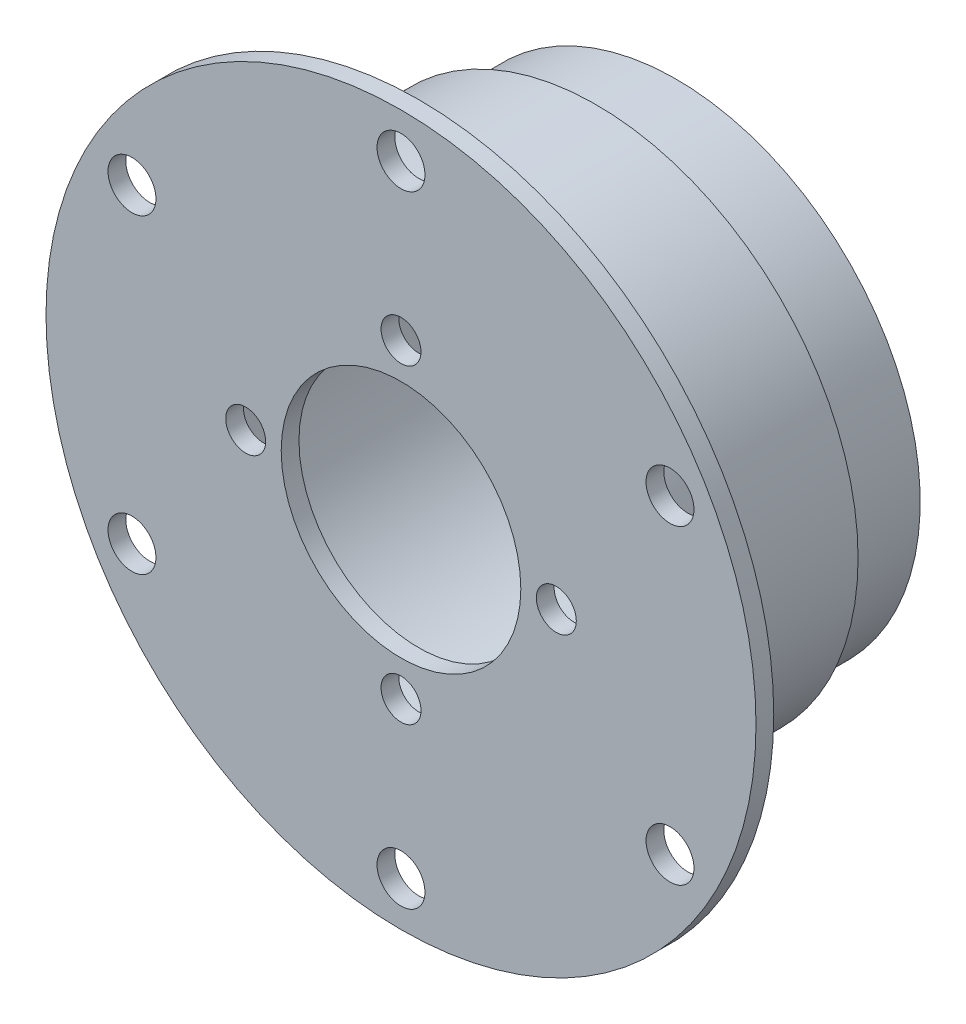
ISO-10303-21;
HEADER;
FILE_DESCRIPTION(('STEP AP214'),'2;1');
FILE_NAME('part.step','',(''),(''),'','','');
FILE_SCHEMA(('AUTOMOTIVE_DESIGN { 1 0 10303 214 1 1 1 1 }'));
ENDSEC;
DATA;
#1=APPLICATION_CONTEXT('core data for automotive mechanical design processes');
#2=APPLICATION_PROTOCOL_DEFINITION('international standard','automotive_design',2000,#1);
#3=PRODUCT_CONTEXT('',#1,'mechanical');
#4=PRODUCT('Part','Part','',(#3));
#5=PRODUCT_RELATED_PRODUCT_CATEGORY('part','',(#4));
#6=PRODUCT_DEFINITION_FORMATION('','',#4);
#7=PRODUCT_DEFINITION_CONTEXT('part definition',#1,'design');
#8=PRODUCT_DEFINITION('design','',#6,#7);
#9=PRODUCT_DEFINITION_SHAPE('','',#8);
#10=(LENGTH_UNIT() NAMED_UNIT(*) SI_UNIT(.MILLI.,.METRE.));
#11=(NAMED_UNIT(*) PLANE_ANGLE_UNIT() SI_UNIT($,.RADIAN.));
#12=(NAMED_UNIT(*) SI_UNIT($,.STERADIAN.) SOLID_ANGLE_UNIT());
#13=UNCERTAINTY_MEASURE_WITH_UNIT(LENGTH_MEASURE(1.E-05),#10,'distance_accuracy_value','');
#14=(GEOMETRIC_REPRESENTATION_CONTEXT(3) GLOBAL_UNCERTAINTY_ASSIGNED_CONTEXT((#13)) GLOBAL_UNIT_ASSIGNED_CONTEXT((#10,
#11,#12)) REPRESENTATION_CONTEXT('',''));
#15=CARTESIAN_POINT('',(0.,0.,0.));
#16=DIRECTION('',(0.,0.,1.));
#17=DIRECTION('',(1.,0.,0.));
#18=AXIS2_PLACEMENT_3D('',#15,#16,#17);
#19=CARTESIAN_POINT('',(0.,0.,-29.));
#20=DIRECTION('',(0.,0.,-1.));
#21=DIRECTION('',(-1.,0.,0.));
#22=AXIS2_PLACEMENT_3D('',#19,#20,#21);
#23=PLANE('',#22);
#24=CARTESIAN_POINT('',(25.,0.,-29.));
#25=DIRECTION('',(0.,0.,-1.));
#26=DIRECTION('',(-1.,0.,0.));
#27=AXIS2_PLACEMENT_3D('',#24,#25,#26);
#28=CIRCLE('',#27,1.24999999999999);
#29=CARTESIAN_POINT('',(23.75,0.,-29.));
#30=VERTEX_POINT('',#29);
#31=EDGE_CURVE('E72',#30,#30,#28,.T.);
#32=ORIENTED_EDGE('',*,*,#31,.F.);
#33=EDGE_LOOP('',(#32));
#34=FACE_BOUND('',#33,.T.);
#35=CARTESIAN_POINT('',(0.,25.,-29.));
#36=DIRECTION('',(0.,0.,-1.));
#37=DIRECTION('',(-1.,0.,0.));
#38=AXIS2_PLACEMENT_3D('',#35,#36,#37);
#39=CIRCLE('',#38,1.24999999999999);
#40=CARTESIAN_POINT('',(-1.25,25.,-29.));
#41=VERTEX_POINT('',#40);
#42=EDGE_CURVE('E71',#41,#41,#39,.T.);
#43=ORIENTED_EDGE('',*,*,#42,.F.);
#44=EDGE_LOOP('',(#43));
#45=FACE_BOUND('',#44,.T.);
#46=CARTESIAN_POINT('',(-25.,0.,-29.));
#47=DIRECTION('',(0.,0.,-1.));
#48=DIRECTION('',(-1.,0.,0.));
#49=AXIS2_PLACEMENT_3D('',#46,#47,#48);
#50=CIRCLE('',#49,1.24999999999999);
#51=CARTESIAN_POINT('',(-26.25,0.,-29.));
#52=VERTEX_POINT('',#51);
#53=EDGE_CURVE('E82',#52,#52,#50,.T.);
#54=ORIENTED_EDGE('',*,*,#53,.F.);
#55=EDGE_LOOP('',(#54));
#56=FACE_BOUND('',#55,.T.);
#57=CARTESIAN_POINT('',(0.,-25.,-29.));
#58=DIRECTION('',(0.,0.,-1.));
#59=DIRECTION('',(-1.,0.,0.));
#60=AXIS2_PLACEMENT_3D('',#57,#58,#59);
#61=CIRCLE('',#60,1.24999999999999);
#62=CARTESIAN_POINT('',(-1.25,-25.,-29.));
#63=VERTEX_POINT('',#62);
#64=EDGE_CURVE('E88',#63,#63,#61,.T.);
#65=ORIENTED_EDGE('',*,*,#64,.F.);
#66=EDGE_LOOP('',(#65));
#67=FACE_BOUND('',#66,.T.);
#68=CARTESIAN_POINT('',(0.,0.,-29.));
#69=DIRECTION('',(0.,0.,-1.));
#70=DIRECTION('',(-1.,0.,0.));
#71=AXIS2_PLACEMENT_3D('',#68,#69,#70);
#72=CIRCLE('',#71,21.5);
#73=CARTESIAN_POINT('',(21.5,0.,-29.));
#74=VERTEX_POINT('',#73);
#75=EDGE_CURVE('E104',#74,#74,#72,.T.);
#76=ORIENTED_EDGE('',*,*,#75,.F.);
#77=EDGE_LOOP('',(#76));
#78=FACE_BOUND('',#77,.T.);
#79=CARTESIAN_POINT('',(0.,0.,-29.));
#80=DIRECTION('',(0.,0.,-1.));
#81=DIRECTION('',(-1.,0.,0.));
#82=AXIS2_PLACEMENT_3D('',#79,#80,#81);
#83=CIRCLE('',#82,27.5);
#84=CARTESIAN_POINT('',(-27.5,0.,-29.));
#85=VERTEX_POINT('',#84);
#86=EDGE_CURVE('E94',#85,#85,#83,.T.);
#87=ORIENTED_EDGE('',*,*,#86,.T.);
#88=EDGE_LOOP('',(#87));
#89=FACE_BOUND('',#88,.T.);
#90=ADVANCED_FACE('F40',(#34,#45,#56,#67,#78,#89),#23,.T.);
#91=CARTESIAN_POINT('',(0.,0.,-29.));
#92=DIRECTION('',(0.,0.,1.));
#93=DIRECTION('',(1.,0.,0.));
#94=AXIS2_PLACEMENT_3D('',#91,#92,#93);
#95=CYLINDRICAL_SURFACE('',#94,29.5);
#96=CARTESIAN_POINT('',(0.,0.,0.));
#97=DIRECTION('',(0.,0.,1.));
#98=DIRECTION('',(1.,0.,0.));
#99=AXIS2_PLACEMENT_3D('',#96,#97,#98);
#100=CIRCLE('',#99,29.5);
#101=CARTESIAN_POINT('',(29.5,0.,0.));
#102=VERTEX_POINT('',#101);
#103=EDGE_CURVE('E11',#102,#102,#100,.F.);
#104=CARTESIAN_POINT('',(0.,0.,-20.));
#105=DIRECTION('',(0.,0.,-1.));
#106=DIRECTION('',(-1.,0.,0.));
#107=AXIS2_PLACEMENT_3D('',#104,#105,#106);
#108=CIRCLE('',#107,29.5);
#109=CARTESIAN_POINT('',(29.5,0.,-20.));
#110=VERTEX_POINT('',#109);
#111=EDGE_CURVE('E98',#110,#110,#108,.T.);
#112=CARTESIAN_POINT('',(29.5,0.,0.));
#113=CARTESIAN_POINT('',(29.5,0.,-0.208333333333334));
#114=CARTESIAN_POINT('',(29.5,0.,-0.416666666666667));
#115=CARTESIAN_POINT('',(29.5,0.,-0.833333333333334));
#116=CARTESIAN_POINT('',(29.5,0.,-1.04166666666667));
#117=CARTESIAN_POINT('',(29.5,0.,-1.45833333333333));
#118=CARTESIAN_POINT('',(29.5,0.,-1.66666666666667));
#119=CARTESIAN_POINT('',(29.5,0.,-2.08333333333334));
#120=CARTESIAN_POINT('',(29.5,0.,-2.29166666666667));
#121=CARTESIAN_POINT('',(29.5,0.,-2.70833333333333));
#122=CARTESIAN_POINT('',(29.5,0.,-2.91666666666667));
#123=CARTESIAN_POINT('',(29.5,0.,-3.33333333333333));
#124=CARTESIAN_POINT('',(29.5,0.,-3.54166666666667));
#125=CARTESIAN_POINT('',(29.5,0.,-3.95833333333333));
#126=CARTESIAN_POINT('',(29.5,0.,-4.16666666666667));
#127=CARTESIAN_POINT('',(29.5,0.,-4.58333333333333));
#128=CARTESIAN_POINT('',(29.5,0.,-4.79166666666667));
#129=CARTESIAN_POINT('',(29.5,0.,-5.20833333333333));
#130=CARTESIAN_POINT('',(29.5,0.,-5.41666666666667));
#131=CARTESIAN_POINT('',(29.5,0.,-5.83333333333334));
#132=CARTESIAN_POINT('',(29.5,0.,-6.04166666666667));
#133=CARTESIAN_POINT('',(29.5,0.,-6.45833333333333));
#134=CARTESIAN_POINT('',(29.5,0.,-6.66666666666667));
#135=CARTESIAN_POINT('',(29.5,0.,-7.08333333333333));
#136=CARTESIAN_POINT('',(29.5,0.,-7.29166666666667));
#137=CARTESIAN_POINT('',(29.5,0.,-7.70833333333333));
#138=CARTESIAN_POINT('',(29.5,0.,-7.91666666666667));
#139=CARTESIAN_POINT('',(29.5,0.,-8.33333333333333));
#140=CARTESIAN_POINT('',(29.5,0.,-8.54166666666667));
#141=CARTESIAN_POINT('',(29.5,0.,-8.95833333333333));
#142=CARTESIAN_POINT('',(29.5,0.,-9.16666666666667));
#143=CARTESIAN_POINT('',(29.5,0.,-9.58333333333333));
#144=CARTESIAN_POINT('',(29.5,0.,-9.79166666666667));
#145=CARTESIAN_POINT('',(29.5,0.,-10.2083333333333));
#146=CARTESIAN_POINT('',(29.5,0.,-10.4166666666667));
#147=CARTESIAN_POINT('',(29.5,0.,-10.8333333333333));
#148=CARTESIAN_POINT('',(29.5,0.,-11.0416666666667));
#149=CARTESIAN_POINT('',(29.5,0.,-11.4583333333333));
#150=CARTESIAN_POINT('',(29.5,0.,-11.6666666666667));
#151=CARTESIAN_POINT('',(29.5,0.,-12.0833333333333));
#152=CARTESIAN_POINT('',(29.5,0.,-12.2916666666667));
#153=CARTESIAN_POINT('',(29.5,0.,-12.7083333333333));
#154=CARTESIAN_POINT('',(29.5,0.,-12.9166666666667));
#155=CARTESIAN_POINT('',(29.5,0.,-13.3333333333333));
#156=CARTESIAN_POINT('',(29.5,0.,-13.5416666666667));
#157=CARTESIAN_POINT('',(29.5,0.,-13.9583333333333));
#158=CARTESIAN_POINT('',(29.5,0.,-14.1666666666667));
#159=CARTESIAN_POINT('',(29.5,0.,-14.5833333333333));
#160=CARTESIAN_POINT('',(29.5,0.,-14.7916666666667));
#161=CARTESIAN_POINT('',(29.5,0.,-15.2083333333333));
#162=CARTESIAN_POINT('',(29.5,0.,-15.4166666666667));
#163=CARTESIAN_POINT('',(29.5,0.,-15.8333333333333));
#164=CARTESIAN_POINT('',(29.5,0.,-16.0416666666667));
#165=CARTESIAN_POINT('',(29.5,0.,-16.4583333333333));
#166=CARTESIAN_POINT('',(29.5,0.,-16.6666666666667));
#167=CARTESIAN_POINT('',(29.5,0.,-17.0833333333333));
#168=CARTESIAN_POINT('',(29.5,0.,-17.2916666666667));
#169=CARTESIAN_POINT('',(29.5,0.,-17.7083333333333));
#170=CARTESIAN_POINT('',(29.5,0.,-17.9166666666667));
#171=CARTESIAN_POINT('',(29.5,0.,-18.3333333333333));
#172=CARTESIAN_POINT('',(29.5,0.,-18.5416666666667));
#173=CARTESIAN_POINT('',(29.5,0.,-18.9583333333333));
#174=CARTESIAN_POINT('',(29.5,0.,-19.1666666666667));
#175=CARTESIAN_POINT('',(29.5,0.,-19.5833333333333));
#176=CARTESIAN_POINT('',(29.5,0.,-19.7916666666667));
#177=CARTESIAN_POINT('',(29.5,0.,-20.));
#178=B_SPLINE_CURVE_WITH_KNOTS('',3,(#112,#113,#114,#115,#116,#117,#118,#119,#120,#121,#122,
#123,#124,#125,#126,#127,#128,#129,#130,#131,#132,#133,#134,#135,#136,#137,#138,#139,#140,#141,
#142,#143,#144,#145,#146,#147,#148,#149,#150,#151,#152,#153,#154,#155,#156,#157,#158,#159,#160,
#161,#162,#163,#164,#165,#166,#167,#168,#169,#170,#171,#172,#173,#174,#175,#176,#177),
.UNSPECIFIED.,.F.,.F.,(4,2,2,2,2,2,2,2,2,2,2,2,2,2,2,2,2,2,2,2,2,2,2,2,2,2,2,2,2,2,2,2,4),(0.,
0.625000000000001,1.25,1.875,2.5,3.125,3.75,4.375,5.,5.625,6.25,6.875,7.5,8.125,8.75,9.375,10.,
10.625,11.25,11.875,12.5,13.125,13.75,14.375,15.,15.625,16.25,16.875,17.5,18.125,18.75,19.375,
20.),.UNSPECIFIED.);
#179=EDGE_CURVE('BSEAM197',#102,#110,#178,.T.);
#180=ORIENTED_EDGE('',*,*,#103,.T.);
#181=ORIENTED_EDGE('',*,*,#111,.F.);
#182=ORIENTED_EDGE('',*,*,#179,.T.);
#183=ORIENTED_EDGE('',*,*,#179,.F.);
#184=EDGE_LOOP('',(#180,#182,#181,#183));
#185=FACE_BOUND('',#184,.T.);
#186=ADVANCED_FACE('F197',(#185),#95,.T.);
#187=CARTESIAN_POINT('',(0.,0.,0.));
#188=DIRECTION('',(0.,0.,1.));
#189=DIRECTION('',(1.,0.,0.));
#190=AXIS2_PLACEMENT_3D('',#187,#188,#189);
#191=PLANE('',#190);
#192=CARTESIAN_POINT('',(0.,0.,0.));
#193=DIRECTION('',(0.,0.,1.));
#194=DIRECTION('',(1.,0.,0.));
#195=AXIS2_PLACEMENT_3D('',#192,#193,#194);
#196=CIRCLE('',#195,13.5);
#197=CARTESIAN_POINT('',(13.5,0.,0.));
#198=VERTEX_POINT('',#197);
#199=EDGE_CURVE('E169',#198,#198,#196,.T.);
#200=ORIENTED_EDGE('',*,*,#199,.T.);
#201=EDGE_LOOP('',(#200));
#202=FACE_BOUND('',#201,.T.);
#203=CARTESIAN_POINT('',(0.,-17.5,0.));
#204=DIRECTION('',(0.,0.,1.));
#205=DIRECTION('',(1.,0.,0.));
#206=AXIS2_PLACEMENT_3D('',#203,#204,#205);
#207=CIRCLE('',#206,2.25);
#208=CARTESIAN_POINT('',(2.25,-17.5,0.));
#209=VERTEX_POINT('',#208);
#210=EDGE_CURVE('E166',#209,#209,#207,.T.);
#211=ORIENTED_EDGE('',*,*,#210,.T.);
#212=EDGE_LOOP('',(#211));
#213=FACE_BOUND('',#212,.T.);
#214=CARTESIAN_POINT('',(17.5,0.,0.));
#215=DIRECTION('',(0.,0.,1.));
#216=DIRECTION('',(1.,0.,0.));
#217=AXIS2_PLACEMENT_3D('',#214,#215,#216);
#218=CIRCLE('',#217,2.25);
#219=CARTESIAN_POINT('',(19.75,0.,0.));
#220=VERTEX_POINT('',#219);
#221=EDGE_CURVE('E160',#220,#220,#218,.T.);
#222=ORIENTED_EDGE('',*,*,#221,.T.);
#223=EDGE_LOOP('',(#222));
#224=FACE_BOUND('',#223,.T.);
#225=CARTESIAN_POINT('',(0.,17.5,0.));
#226=DIRECTION('',(0.,0.,1.));
#227=DIRECTION('',(1.,0.,0.));
#228=AXIS2_PLACEMENT_3D('',#225,#226,#227);
#229=CIRCLE('',#228,2.25);
#230=CARTESIAN_POINT('',(2.25,17.5,0.));
#231=VERTEX_POINT('',#230);
#232=EDGE_CURVE('E154',#231,#231,#229,.T.);
#233=ORIENTED_EDGE('',*,*,#232,.T.);
#234=EDGE_LOOP('',(#233));
#235=FACE_BOUND('',#234,.T.);
#236=CARTESIAN_POINT('',(-17.5,0.,0.));
#237=DIRECTION('',(0.,0.,1.));
#238=DIRECTION('',(1.,0.,0.));
#239=AXIS2_PLACEMENT_3D('',#236,#237,#238);
#240=CIRCLE('',#239,2.25);
#241=CARTESIAN_POINT('',(-15.25,0.,0.));
#242=VERTEX_POINT('',#241);
#243=EDGE_CURVE('E148',#242,#242,#240,.T.);
#244=ORIENTED_EDGE('',*,*,#243,.T.);
#245=EDGE_LOOP('',(#244));
#246=FACE_BOUND('',#245,.T.);
#247=CARTESIAN_POINT('',(0.,0.,0.));
#248=DIRECTION('',(0.,0.,-1.));
#249=DIRECTION('',(-1.,0.,0.));
#250=AXIS2_PLACEMENT_3D('',#247,#248,#249);
#251=CIRCLE('',#250,21.5);
#252=CARTESIAN_POINT('',(21.5,0.,0.));
#253=VERTEX_POINT('',#252);
#254=EDGE_CURVE('E103',#253,#253,#251,.T.);
#255=ORIENTED_EDGE('',*,*,#254,.T.);
#256=EDGE_LOOP('',(#255));
#257=FACE_BOUND('',#256,.T.);
#258=ADVANCED_FACE('F185',(#202,#213,#224,#235,#246,#257),#191,.F.);
#259=CARTESIAN_POINT('',(0.,0.,2.));
#260=DIRECTION('',(0.,0.,1.));
#261=DIRECTION('',(1.,0.,0.));
#262=AXIS2_PLACEMENT_3D('',#259,#260,#261);
#263=PLANE('',#262);
#264=CARTESIAN_POINT('',(0.,35.,2.));
#265=DIRECTION('',(0.,0.,-1.));
#266=DIRECTION('',(-1.,0.,0.));
#267=AXIS2_PLACEMENT_3D('',#264,#265,#266);
#268=CIRCLE('',#267,2.7);
#269=CARTESIAN_POINT('',(-2.7,35.,2.));
#270=VERTEX_POINT('',#269);
#271=EDGE_CURVE('E112',#270,#270,#268,.T.);
#272=ORIENTED_EDGE('',*,*,#271,.T.);
#273=EDGE_LOOP('',(#272));
#274=FACE_BOUND('',#273,.T.);
#275=CARTESIAN_POINT('',(-30.3108891324554,17.4999999999999,2.));
#276=DIRECTION('',(0.,0.,-1.));
#277=DIRECTION('',(-1.,0.,0.));
#278=AXIS2_PLACEMENT_3D('',#275,#276,#277);
#279=CIRCLE('',#278,2.7);
#280=CARTESIAN_POINT('',(-33.0108891324554,17.4999999999999,2.));
#281=VERTEX_POINT('',#280);
#282=EDGE_CURVE('E118',#281,#281,#279,.T.);
#283=ORIENTED_EDGE('',*,*,#282,.T.);
#284=EDGE_LOOP('',(#283));
#285=FACE_BOUND('',#284,.T.);
#286=CARTESIAN_POINT('',(-30.3108891324553,-17.5000000000001,2.));
#287=DIRECTION('',(0.,0.,-1.));
#288=DIRECTION('',(-1.,0.,0.));
#289=AXIS2_PLACEMENT_3D('',#286,#287,#288);
#290=CIRCLE('',#289,2.7);
#291=CARTESIAN_POINT('',(-33.0108891324553,-17.5000000000001,2.));
#292=VERTEX_POINT('',#291);
#293=EDGE_CURVE('E124',#292,#292,#290,.T.);
#294=ORIENTED_EDGE('',*,*,#293,.T.);
#295=EDGE_LOOP('',(#294));
#296=FACE_BOUND('',#295,.T.);
#297=CARTESIAN_POINT('',(2.44403693719019E-13,-35.,2.));
#298=DIRECTION('',(0.,0.,-1.));
#299=DIRECTION('',(-1.,0.,0.));
#300=AXIS2_PLACEMENT_3D('',#297,#298,#299);
#301=CIRCLE('',#300,2.7);
#302=CARTESIAN_POINT('',(-2.69999999999976,-35.,2.));
#303=VERTEX_POINT('',#302);
#304=EDGE_CURVE('E130',#303,#303,#301,.T.);
#305=ORIENTED_EDGE('',*,*,#304,.T.);
#306=EDGE_LOOP('',(#305));
#307=FACE_BOUND('',#306,.T.);
#308=CARTESIAN_POINT('',(30.3108891324555,-17.4999999999997,2.));
#309=DIRECTION('',(0.,0.,-1.));
#310=DIRECTION('',(-1.,0.,0.));
#311=AXIS2_PLACEMENT_3D('',#308,#309,#310);
#312=CIRCLE('',#311,2.7);
#313=CARTESIAN_POINT('',(27.6108891324555,-17.4999999999997,2.));
#314=VERTEX_POINT('',#313);
#315=EDGE_CURVE('E136',#314,#314,#312,.T.);
#316=ORIENTED_EDGE('',*,*,#315,.T.);
#317=EDGE_LOOP('',(#316));
#318=FACE_BOUND('',#317,.T.);
#319=CARTESIAN_POINT('',(30.3108891324552,17.5000000000004,2.));
#320=DIRECTION('',(0.,0.,-1.));
#321=DIRECTION('',(-1.,0.,0.));
#322=AXIS2_PLACEMENT_3D('',#319,#320,#321);
#323=CIRCLE('',#322,2.7);
#324=CARTESIAN_POINT('',(27.6108891324551,17.5000000000004,2.));
#325=VERTEX_POINT('',#324);
#326=EDGE_CURVE('E142',#325,#325,#323,.T.);
#327=ORIENTED_EDGE('',*,*,#326,.T.);
#328=EDGE_LOOP('',(#327));
#329=FACE_BOUND('',#328,.T.);
#330=CARTESIAN_POINT('',(-17.5,0.,2.));
#331=DIRECTION('',(0.,0.,1.));
#332=DIRECTION('',(1.,0.,0.));
#333=AXIS2_PLACEMENT_3D('',#330,#331,#332);
#334=CIRCLE('',#333,2.24999999999999);
#335=CARTESIAN_POINT('',(-15.25,0.,2.));
#336=VERTEX_POINT('',#335);
#337=EDGE_CURVE('E145',#336,#336,#334,.T.);
#338=ORIENTED_EDGE('',*,*,#337,.F.);
#339=EDGE_LOOP('',(#338));
#340=FACE_BOUND('',#339,.T.);
#341=CARTESIAN_POINT('',(0.,17.5,2.));
#342=DIRECTION('',(0.,0.,1.));
#343=DIRECTION('',(1.,0.,0.));
#344=AXIS2_PLACEMENT_3D('',#341,#342,#343);
#345=CIRCLE('',#344,2.24999999999999);
#346=CARTESIAN_POINT('',(2.24999999999999,17.5,2.));
#347=VERTEX_POINT('',#346);
#348=EDGE_CURVE('E151',#347,#347,#345,.T.);
#349=ORIENTED_EDGE('',*,*,#348,.F.);
#350=EDGE_LOOP('',(#349));
#351=FACE_BOUND('',#350,.T.);
#352=CARTESIAN_POINT('',(17.5,0.,2.));
#353=DIRECTION('',(0.,0.,1.));
#354=DIRECTION('',(1.,0.,0.));
#355=AXIS2_PLACEMENT_3D('',#352,#353,#354);
#356=CIRCLE('',#355,2.24999999999999);
#357=CARTESIAN_POINT('',(19.75,0.,2.));
#358=VERTEX_POINT('',#357);
#359=EDGE_CURVE('E157',#358,#358,#356,.T.);
#360=ORIENTED_EDGE('',*,*,#359,.F.);
#361=EDGE_LOOP('',(#360));
#362=FACE_BOUND('',#361,.T.);
#363=CARTESIAN_POINT('',(0.,-17.5,2.));
#364=DIRECTION('',(0.,0.,1.));
#365=DIRECTION('',(1.,0.,0.));
#366=AXIS2_PLACEMENT_3D('',#363,#364,#365);
#367=CIRCLE('',#366,2.24999999999999);
#368=CARTESIAN_POINT('',(2.24999999999999,-17.5,2.));
#369=VERTEX_POINT('',#368);
#370=EDGE_CURVE('E163',#369,#369,#367,.T.);
#371=ORIENTED_EDGE('',*,*,#370,.F.);
#372=EDGE_LOOP('',(#371));
#373=FACE_BOUND('',#372,.T.);
#374=CARTESIAN_POINT('',(0.,0.,2.));
#375=DIRECTION('',(0.,0.,1.));
#376=DIRECTION('',(1.,0.,0.));
#377=AXIS2_PLACEMENT_3D('',#374,#375,#376);
#378=CIRCLE('',#377,40.);
#379=CARTESIAN_POINT('',(40.,0.,2.));
#380=VERTEX_POINT('',#379);
#381=EDGE_CURVE('E48',#380,#380,#378,.T.);
#382=ORIENTED_EDGE('',*,*,#381,.T.);
#383=EDGE_LOOP('',(#382));
#384=FACE_BOUND('',#383,.T.);
#385=CARTESIAN_POINT('',(0.,0.,2.));
#386=DIRECTION('',(0.,0.,1.));
#387=DIRECTION('',(1.,0.,0.));
#388=AXIS2_PLACEMENT_3D('',#385,#386,#387);
#389=CIRCLE('',#388,13.5);
#390=CARTESIAN_POINT('',(13.5,0.,2.));
#391=VERTEX_POINT('',#390);
#392=EDGE_CURVE('E170',#391,#391,#389,.T.);
#393=ORIENTED_EDGE('',*,*,#392,.F.);
#394=EDGE_LOOP('',(#393));
#395=FACE_BOUND('',#394,.T.);
#396=ADVANCED_FACE('F183',(#274,#285,#296,#307,#318,#329,#340,#351,#362,#373,#384,#395),#263,.T.);
#397=ORIENTED_EDGE('',*,*,#103,.F.);
#398=EDGE_LOOP('',(#397));
#399=FACE_BOUND('',#398,.T.);
#400=CARTESIAN_POINT('',(0.,35.,0.));
#401=DIRECTION('',(0.,0.,-1.));
#402=DIRECTION('',(-1.,0.,0.));
#403=AXIS2_PLACEMENT_3D('',#400,#401,#402);
#404=CIRCLE('',#403,2.7);
#405=CARTESIAN_POINT('',(-2.7,35.,0.));
#406=VERTEX_POINT('',#405);
#407=EDGE_CURVE('E107',#406,#406,#404,.T.);
#408=ORIENTED_EDGE('',*,*,#407,.F.);
#409=EDGE_LOOP('',(#408));
#410=FACE_BOUND('',#409,.T.);
#411=CARTESIAN_POINT('',(-30.3108891324554,17.4999999999999,0.));
#412=DIRECTION('',(0.,0.,-1.));
#413=DIRECTION('',(-1.,0.,0.));
#414=AXIS2_PLACEMENT_3D('',#411,#412,#413);
#415=CIRCLE('',#414,2.7);
#416=CARTESIAN_POINT('',(-33.0108891324554,17.4999999999999,0.));
#417=VERTEX_POINT('',#416);
#418=EDGE_CURVE('E115',#417,#417,#415,.T.);
#419=ORIENTED_EDGE('',*,*,#418,.F.);
#420=EDGE_LOOP('',(#419));
#421=FACE_BOUND('',#420,.T.);
#422=CARTESIAN_POINT('',(-30.3108891324553,-17.5000000000001,0.));
#423=DIRECTION('',(0.,0.,-1.));
#424=DIRECTION('',(-1.,0.,0.));
#425=AXIS2_PLACEMENT_3D('',#422,#423,#424);
#426=CIRCLE('',#425,2.7);
#427=CARTESIAN_POINT('',(-33.0108891324553,-17.5000000000001,0.));
#428=VERTEX_POINT('',#427);
#429=EDGE_CURVE('E121',#428,#428,#426,.T.);
#430=ORIENTED_EDGE('',*,*,#429,.F.);
#431=EDGE_LOOP('',(#430));
#432=FACE_BOUND('',#431,.T.);
#433=CARTESIAN_POINT('',(2.44403693719019E-13,-35.,0.));
#434=DIRECTION('',(0.,0.,-1.));
#435=DIRECTION('',(-1.,0.,0.));
#436=AXIS2_PLACEMENT_3D('',#433,#434,#435);
#437=CIRCLE('',#436,2.7);
#438=CARTESIAN_POINT('',(-2.69999999999976,-35.,0.));
#439=VERTEX_POINT('',#438);
#440=EDGE_CURVE('E127',#439,#439,#437,.T.);
#441=ORIENTED_EDGE('',*,*,#440,.F.);
#442=EDGE_LOOP('',(#441));
#443=FACE_BOUND('',#442,.T.);
#444=CARTESIAN_POINT('',(30.3108891324555,-17.4999999999997,0.));
#445=DIRECTION('',(0.,0.,-1.));
#446=DIRECTION('',(-1.,0.,0.));
#447=AXIS2_PLACEMENT_3D('',#444,#445,#446);
#448=CIRCLE('',#447,2.7);
#449=CARTESIAN_POINT('',(27.6108891324555,-17.4999999999997,0.));
#450=VERTEX_POINT('',#449);
#451=EDGE_CURVE('E133',#450,#450,#448,.T.);
#452=ORIENTED_EDGE('',*,*,#451,.F.);
#453=EDGE_LOOP('',(#452));
#454=FACE_BOUND('',#453,.T.);
#455=CARTESIAN_POINT('',(30.3108891324552,17.5000000000004,0.));
#456=DIRECTION('',(0.,0.,-1.));
#457=DIRECTION('',(-1.,0.,0.));
#458=AXIS2_PLACEMENT_3D('',#455,#456,#457);
#459=CIRCLE('',#458,2.7);
#460=CARTESIAN_POINT('',(27.6108891324551,17.5000000000004,0.));
#461=VERTEX_POINT('',#460);
#462=EDGE_CURVE('E139',#461,#461,#459,.T.);
#463=ORIENTED_EDGE('',*,*,#462,.F.);
#464=EDGE_LOOP('',(#463));
#465=FACE_BOUND('',#464,.T.);
#466=CARTESIAN_POINT('',(0.,0.,0.));
#467=DIRECTION('',(0.,0.,1.));
#468=DIRECTION('',(1.,0.,0.));
#469=AXIS2_PLACEMENT_3D('',#466,#467,#468);
#470=CIRCLE('',#469,40.);
#471=CARTESIAN_POINT('',(40.,0.,0.));
#472=VERTEX_POINT('',#471);
#473=EDGE_CURVE('E173',#472,#472,#470,.T.);
#474=ORIENTED_EDGE('',*,*,#473,.F.);
#475=EDGE_LOOP('',(#474));
#476=FACE_BOUND('',#475,.T.);
#477=ADVANCED_FACE('F181',(#399,#410,#421,#432,#443,#454,#465,#476),#191,.F.);
#478=CARTESIAN_POINT('',(0.,0.,2.));
#479=DIRECTION('',(0.,0.,-1.));
#480=DIRECTION('',(-1.,0.,0.));
#481=AXIS2_PLACEMENT_3D('',#478,#479,#480);
#482=CYLINDRICAL_SURFACE('',#481,40.);
#483=ORIENTED_EDGE('',*,*,#381,.F.);
#484=EDGE_LOOP('',(#483));
#485=FACE_BOUND('',#484,.T.);
#486=ORIENTED_EDGE('',*,*,#473,.T.);
#487=EDGE_LOOP('',(#486));
#488=FACE_BOUND('',#487,.T.);
#489=ADVANCED_FACE('F42',(#485,#488),#482,.T.);
#490=CARTESIAN_POINT('',(0.,0.,2.));
#491=DIRECTION('',(0.,0.,-1.));
#492=DIRECTION('',(-1.,0.,0.));
#493=AXIS2_PLACEMENT_3D('',#490,#491,#492);
#494=CYLINDRICAL_SURFACE('',#493,13.5);
#495=ORIENTED_EDGE('',*,*,#392,.T.);
#496=EDGE_LOOP('',(#495));
#497=FACE_BOUND('',#496,.T.);
#498=ORIENTED_EDGE('',*,*,#199,.F.);
#499=EDGE_LOOP('',(#498));
#500=FACE_BOUND('',#499,.T.);
#501=ADVANCED_FACE('F190',(#497,#500),#494,.F.);
#502=CARTESIAN_POINT('',(0.,-17.5,2.));
#503=DIRECTION('',(0.,0.,1.));
#504=DIRECTION('',(1.,0.,0.));
#505=AXIS2_PLACEMENT_3D('',#502,#503,#504);
#506=CYLINDRICAL_SURFACE('',#505,2.24999999999999);
#507=ORIENTED_EDGE('',*,*,#210,.F.);
#508=EDGE_LOOP('',(#507));
#509=FACE_BOUND('',#508,.T.);
#510=ORIENTED_EDGE('',*,*,#370,.T.);
#511=EDGE_LOOP('',(#510));
#512=FACE_BOUND('',#511,.T.);
#513=ADVANCED_FACE('F248',(#509,#512),#506,.F.);
#514=CARTESIAN_POINT('',(17.5,0.,2.));
#515=DIRECTION('',(0.,0.,1.));
#516=DIRECTION('',(1.,0.,0.));
#517=AXIS2_PLACEMENT_3D('',#514,#515,#516);
#518=CYLINDRICAL_SURFACE('',#517,2.24999999999999);
#519=ORIENTED_EDGE('',*,*,#221,.F.);
#520=EDGE_LOOP('',(#519));
#521=FACE_BOUND('',#520,.T.);
#522=ORIENTED_EDGE('',*,*,#359,.T.);
#523=EDGE_LOOP('',(#522));
#524=FACE_BOUND('',#523,.T.);
#525=ADVANCED_FACE('F244',(#521,#524),#518,.F.);
#526=CARTESIAN_POINT('',(0.,17.5,2.));
#527=DIRECTION('',(0.,0.,1.));
#528=DIRECTION('',(1.,0.,0.));
#529=AXIS2_PLACEMENT_3D('',#526,#527,#528);
#530=CYLINDRICAL_SURFACE('',#529,2.24999999999999);
#531=ORIENTED_EDGE('',*,*,#232,.F.);
#532=EDGE_LOOP('',(#531));
#533=FACE_BOUND('',#532,.T.);
#534=ORIENTED_EDGE('',*,*,#348,.T.);
#535=EDGE_LOOP('',(#534));
#536=FACE_BOUND('',#535,.T.);
#537=ADVANCED_FACE('F240',(#533,#536),#530,.F.);
#538=CARTESIAN_POINT('',(-17.5,0.,2.));
#539=DIRECTION('',(0.,0.,1.));
#540=DIRECTION('',(1.,0.,0.));
#541=AXIS2_PLACEMENT_3D('',#538,#539,#540);
#542=CYLINDRICAL_SURFACE('',#541,2.24999999999999);
#543=ORIENTED_EDGE('',*,*,#243,.F.);
#544=EDGE_LOOP('',(#543));
#545=FACE_BOUND('',#544,.T.);
#546=ORIENTED_EDGE('',*,*,#337,.T.);
#547=EDGE_LOOP('',(#546));
#548=FACE_BOUND('',#547,.T.);
#549=ADVANCED_FACE('F236',(#545,#548),#542,.F.);
#550=CARTESIAN_POINT('',(30.3108891324552,17.5000000000004,0.));
#551=DIRECTION('',(0.,0.,-1.));
#552=DIRECTION('',(-1.,0.,0.));
#553=AXIS2_PLACEMENT_3D('',#550,#551,#552);
#554=CYLINDRICAL_SURFACE('',#553,2.7);
#555=ORIENTED_EDGE('',*,*,#326,.F.);
#556=EDGE_LOOP('',(#555));
#557=FACE_BOUND('',#556,.T.);
#558=ORIENTED_EDGE('',*,*,#462,.T.);
#559=EDGE_LOOP('',(#558));
#560=FACE_BOUND('',#559,.T.);
#561=ADVANCED_FACE('F232',(#557,#560),#554,.F.);
#562=CARTESIAN_POINT('',(30.3108891324555,-17.4999999999997,0.));
#563=DIRECTION('',(0.,0.,-1.));
#564=DIRECTION('',(-1.,0.,0.));
#565=AXIS2_PLACEMENT_3D('',#562,#563,#564);
#566=CYLINDRICAL_SURFACE('',#565,2.7);
#567=ORIENTED_EDGE('',*,*,#315,.F.);
#568=EDGE_LOOP('',(#567));
#569=FACE_BOUND('',#568,.T.);
#570=ORIENTED_EDGE('',*,*,#451,.T.);
#571=EDGE_LOOP('',(#570));
#572=FACE_BOUND('',#571,.T.);
#573=ADVANCED_FACE('F228',(#569,#572),#566,.F.);
#574=CARTESIAN_POINT('',(2.44403693719019E-13,-35.,0.));
#575=DIRECTION('',(0.,0.,-1.));
#576=DIRECTION('',(-1.,0.,0.));
#577=AXIS2_PLACEMENT_3D('',#574,#575,#576);
#578=CYLINDRICAL_SURFACE('',#577,2.7);
#579=ORIENTED_EDGE('',*,*,#304,.F.);
#580=EDGE_LOOP('',(#579));
#581=FACE_BOUND('',#580,.T.);
#582=ORIENTED_EDGE('',*,*,#440,.T.);
#583=EDGE_LOOP('',(#582));
#584=FACE_BOUND('',#583,.T.);
#585=ADVANCED_FACE('F224',(#581,#584),#578,.F.);
#586=CARTESIAN_POINT('',(-30.3108891324553,-17.5000000000001,0.));
#587=DIRECTION('',(0.,0.,-1.));
#588=DIRECTION('',(-1.,0.,0.));
#589=AXIS2_PLACEMENT_3D('',#586,#587,#588);
#590=CYLINDRICAL_SURFACE('',#589,2.7);
#591=ORIENTED_EDGE('',*,*,#293,.F.);
#592=EDGE_LOOP('',(#591));
#593=FACE_BOUND('',#592,.T.);
#594=ORIENTED_EDGE('',*,*,#429,.T.);
#595=EDGE_LOOP('',(#594));
#596=FACE_BOUND('',#595,.T.);
#597=ADVANCED_FACE('F220',(#593,#596),#590,.F.);
#598=CARTESIAN_POINT('',(-30.3108891324554,17.4999999999999,0.));
#599=DIRECTION('',(0.,0.,-1.));
#600=DIRECTION('',(-1.,0.,0.));
#601=AXIS2_PLACEMENT_3D('',#598,#599,#600);
#602=CYLINDRICAL_SURFACE('',#601,2.7);
#603=ORIENTED_EDGE('',*,*,#282,.F.);
#604=EDGE_LOOP('',(#603));
#605=FACE_BOUND('',#604,.T.);
#606=ORIENTED_EDGE('',*,*,#418,.T.);
#607=EDGE_LOOP('',(#606));
#608=FACE_BOUND('',#607,.T.);
#609=ADVANCED_FACE('F216',(#605,#608),#602,.F.);
#610=CARTESIAN_POINT('',(0.,35.,0.));
#611=DIRECTION('',(0.,0.,-1.));
#612=DIRECTION('',(-1.,0.,0.));
#613=AXIS2_PLACEMENT_3D('',#610,#611,#612);
#614=CYLINDRICAL_SURFACE('',#613,2.7);
#615=ORIENTED_EDGE('',*,*,#271,.F.);
#616=EDGE_LOOP('',(#615));
#617=FACE_BOUND('',#616,.T.);
#618=ORIENTED_EDGE('',*,*,#407,.T.);
#619=EDGE_LOOP('',(#618));
#620=FACE_BOUND('',#619,.T.);
#621=ADVANCED_FACE('F213',(#617,#620),#614,.F.);
#622=CARTESIAN_POINT('',(0.,0.,-29.));
#623=DIRECTION('',(0.,0.,1.));
#624=DIRECTION('',(1.,0.,0.));
#625=AXIS2_PLACEMENT_3D('',#622,#623,#624);
#626=CYLINDRICAL_SURFACE('',#625,21.5);
#627=CARTESIAN_POINT('',(21.5,0.,-29.));
#628=CARTESIAN_POINT('',(21.5,0.,-28.6979166666667));
#629=CARTESIAN_POINT('',(21.5,0.,-28.3958333333333));
#630=CARTESIAN_POINT('',(21.5,0.,-27.7916666666667));
#631=CARTESIAN_POINT('',(21.5,0.,-27.4895833333333));
#632=CARTESIAN_POINT('',(21.5,0.,-26.8854166666667));
#633=CARTESIAN_POINT('',(21.5,0.,-26.5833333333333));
#634=CARTESIAN_POINT('',(21.5,0.,-25.9791666666667));
#635=CARTESIAN_POINT('',(21.5,0.,-25.6770833333333));
#636=CARTESIAN_POINT('',(21.5,0.,-25.0729166666667));
#637=CARTESIAN_POINT('',(21.5,0.,-24.7708333333333));
#638=CARTESIAN_POINT('',(21.5,0.,-24.1666666666667));
#639=CARTESIAN_POINT('',(21.5,0.,-23.8645833333333));
#640=CARTESIAN_POINT('',(21.5,0.,-23.2604166666667));
#641=CARTESIAN_POINT('',(21.5,0.,-22.9583333333333));
#642=CARTESIAN_POINT('',(21.5,0.,-22.3541666666667));
#643=CARTESIAN_POINT('',(21.5,0.,-22.0520833333333));
#644=CARTESIAN_POINT('',(21.5,0.,-21.4479166666667));
#645=CARTESIAN_POINT('',(21.5,0.,-21.1458333333333));
#646=CARTESIAN_POINT('',(21.5,0.,-20.5416666666667));
#647=CARTESIAN_POINT('',(21.5,0.,-20.2395833333333));
#648=CARTESIAN_POINT('',(21.5,0.,-19.6354166666667));
#649=CARTESIAN_POINT('',(21.5,0.,-19.3333333333333));
#650=CARTESIAN_POINT('',(21.5,0.,-18.7291666666667));
#651=CARTESIAN_POINT('',(21.5,0.,-18.4270833333333));
#652=CARTESIAN_POINT('',(21.5,0.,-17.8229166666667));
#653=CARTESIAN_POINT('',(21.5,0.,-17.5208333333333));
#654=CARTESIAN_POINT('',(21.5,0.,-16.9166666666667));
#655=CARTESIAN_POINT('',(21.5,0.,-16.6145833333333));
#656=CARTESIAN_POINT('',(21.5,0.,-16.0104166666667));
#657=CARTESIAN_POINT('',(21.5,0.,-15.7083333333333));
#658=CARTESIAN_POINT('',(21.5,0.,-15.1041666666667));
#659=CARTESIAN_POINT('',(21.5,0.,-14.8020833333333));
#660=CARTESIAN_POINT('',(21.5,0.,-14.1979166666667));
#661=CARTESIAN_POINT('',(21.5,0.,-13.8958333333333));
#662=CARTESIAN_POINT('',(21.5,0.,-13.2916666666667));
#663=CARTESIAN_POINT('',(21.5,0.,-12.9895833333333));
#664=CARTESIAN_POINT('',(21.5,0.,-12.3854166666667));
#665=CARTESIAN_POINT('',(21.5,0.,-12.0833333333333));
#666=CARTESIAN_POINT('',(21.5,0.,-11.4791666666667));
#667=CARTESIAN_POINT('',(21.5,0.,-11.1770833333333));
#668=CARTESIAN_POINT('',(21.5,0.,-10.5729166666667));
#669=CARTESIAN_POINT('',(21.5,0.,-10.2708333333333));
#670=CARTESIAN_POINT('',(21.5,0.,-9.66666666666667));
#671=CARTESIAN_POINT('',(21.5,0.,-9.36458333333333));
#672=CARTESIAN_POINT('',(21.5,0.,-8.76041666666667));
#673=CARTESIAN_POINT('',(21.5,0.,-8.45833333333333));
#674=CARTESIAN_POINT('',(21.5,0.,-7.85416666666667));
#675=CARTESIAN_POINT('',(21.5,0.,-7.55208333333333));
#676=CARTESIAN_POINT('',(21.5,0.,-6.94791666666667));
#677=CARTESIAN_POINT('',(21.5,0.,-6.64583333333333));
#678=CARTESIAN_POINT('',(21.5,0.,-6.04166666666667));
#679=CARTESIAN_POINT('',(21.5,0.,-5.73958333333333));
#680=CARTESIAN_POINT('',(21.5,0.,-5.13541666666667));
#681=CARTESIAN_POINT('',(21.5,0.,-4.83333333333333));
#682=CARTESIAN_POINT('',(21.5,0.,-4.22916666666667));
#683=CARTESIAN_POINT('',(21.5,0.,-3.92708333333333));
#684=CARTESIAN_POINT('',(21.5,0.,-3.32291666666667));
#685=CARTESIAN_POINT('',(21.5,0.,-3.02083333333333));
#686=CARTESIAN_POINT('',(21.5,0.,-2.41666666666667));
#687=CARTESIAN_POINT('',(21.5,0.,-2.11458333333333));
#688=CARTESIAN_POINT('',(21.5,0.,-1.51041666666667));
#689=CARTESIAN_POINT('',(21.5,0.,-1.20833333333333));
#690=CARTESIAN_POINT('',(21.5,0.,-0.604166666666667));
#691=CARTESIAN_POINT('',(21.5,0.,-0.302083333333333));
#692=CARTESIAN_POINT('',(21.5,0.,0.));
#693=B_SPLINE_CURVE_WITH_KNOTS('',3,(#627,#628,#629,#630,#631,#632,#633,#634,#635,#636,#637,
#638,#639,#640,#641,#642,#643,#644,#645,#646,#647,#648,#649,#650,#651,#652,#653,#654,#655,#656,
#657,#658,#659,#660,#661,#662,#663,#664,#665,#666,#667,#668,#669,#670,#671,#672,#673,#674,#675,
#676,#677,#678,#679,#680,#681,#682,#683,#684,#685,#686,#687,#688,#689,#690,#691,#692),
.UNSPECIFIED.,.F.,.F.,(4,2,2,2,2,2,2,2,2,2,2,2,2,2,2,2,2,2,2,2,2,2,2,2,2,2,2,2,2,2,2,2,4),(0.,
0.906249999999997,1.8125,2.71875,3.625,4.53125,5.4375,6.34375,7.25,8.15625,9.0625,9.96875,
10.875,11.78125,12.6875,13.59375,14.5,15.40625,16.3125,17.21875,18.125,19.03125,19.9375,
20.84375,21.75,22.65625,23.5625,24.46875,25.375,26.28125,27.1875,28.09375,29.),.UNSPECIFIED.);
#694=EDGE_CURVE('BSEAM210',#74,#253,#693,.T.);
#695=ORIENTED_EDGE('',*,*,#75,.T.);
#696=ORIENTED_EDGE('',*,*,#254,.F.);
#697=ORIENTED_EDGE('',*,*,#694,.T.);
#698=ORIENTED_EDGE('',*,*,#694,.F.);
#699=EDGE_LOOP('',(#695,#697,#696,#698));
#700=FACE_BOUND('',#699,.T.);
#701=ADVANCED_FACE('F210',(#700),#626,.F.);
#702=CARTESIAN_POINT('',(0.,0.,-20.));
#703=DIRECTION('',(0.,0.,-1.));
#704=DIRECTION('',(-1.,0.,0.));
#705=AXIS2_PLACEMENT_3D('',#702,#703,#704);
#706=PLANE('',#705);
#707=CARTESIAN_POINT('',(0.,0.,-20.));
#708=DIRECTION('',(0.,0.,-1.));
#709=DIRECTION('',(-1.,0.,0.));
#710=AXIS2_PLACEMENT_3D('',#707,#708,#709);
#711=CIRCLE('',#710,27.5);
#712=CARTESIAN_POINT('',(-27.5,0.,-20.));
#713=VERTEX_POINT('',#712);
#714=EDGE_CURVE('E95',#713,#713,#711,.T.);
#715=ORIENTED_EDGE('',*,*,#714,.F.);
#716=EDGE_LOOP('',(#715));
#717=FACE_BOUND('',#716,.T.);
#718=ORIENTED_EDGE('',*,*,#111,.T.);
#719=EDGE_LOOP('',(#718));
#720=FACE_BOUND('',#719,.T.);
#721=ADVANCED_FACE('F272',(#717,#720),#706,.T.);
#722=CARTESIAN_POINT('',(0.,0.,-20.));
#723=DIRECTION('',(0.,0.,-1.));
#724=DIRECTION('',(-1.,0.,0.));
#725=AXIS2_PLACEMENT_3D('',#722,#723,#724);
#726=CYLINDRICAL_SURFACE('',#725,27.5);
#727=ORIENTED_EDGE('',*,*,#714,.T.);
#728=EDGE_LOOP('',(#727));
#729=FACE_BOUND('',#728,.T.);
#730=ORIENTED_EDGE('',*,*,#86,.F.);
#731=EDGE_LOOP('',(#730));
#732=FACE_BOUND('',#731,.T.);
#733=ADVANCED_FACE('F277',(#729,#732),#726,.T.);
#734=CARTESIAN_POINT('',(0.,-25.,-20.5));
#735=DIRECTION('',(0.,0.,-1.));
#736=DIRECTION('',(-1.,0.,0.));
#737=AXIS2_PLACEMENT_3D('',#734,#735,#736);
#738=CONICAL_SURFACE('',#737,1.25,1.02974425867665);
#739=CARTESIAN_POINT('',(0.,-25.,-19.7489242262155));
#740=VERTEX_POINT('',#739);
#741=VERTEX_LOOP('',#740);
#742=FACE_BOUND('',#741,.T.);
#743=CARTESIAN_POINT('',(0.,-25.,-20.5));
#744=DIRECTION('',(0.,0.,-1.));
#745=DIRECTION('',(-1.,0.,0.));
#746=AXIS2_PLACEMENT_3D('',#743,#744,#745);
#747=CIRCLE('',#746,1.25);
#748=CARTESIAN_POINT('',(-1.25,-25.,-20.5));
#749=VERTEX_POINT('',#748);
#750=EDGE_CURVE('E91',#749,#749,#747,.T.);
#751=ORIENTED_EDGE('',*,*,#750,.T.);
#752=EDGE_LOOP('',(#751));
#753=FACE_BOUND('',#752,.T.);
#754=ADVANCED_FACE('F285',(#742,#753),#738,.F.);
#755=CARTESIAN_POINT('',(0.,-25.,-29.));
#756=DIRECTION('',(0.,0.,-1.));
#757=DIRECTION('',(-1.,0.,0.));
#758=AXIS2_PLACEMENT_3D('',#755,#756,#757);
#759=CYLINDRICAL_SURFACE('',#758,1.24999999999999);
#760=ORIENTED_EDGE('',*,*,#750,.F.);
#761=EDGE_LOOP('',(#760));
#762=FACE_BOUND('',#761,.T.);
#763=ORIENTED_EDGE('',*,*,#64,.T.);
#764=EDGE_LOOP('',(#763));
#765=FACE_BOUND('',#764,.T.);
#766=ADVANCED_FACE('F291',(#762,#765),#759,.F.);
#767=CARTESIAN_POINT('',(-25.,0.,-20.5));
#768=DIRECTION('',(0.,0.,-1.));
#769=DIRECTION('',(-1.,0.,0.));
#770=AXIS2_PLACEMENT_3D('',#767,#768,#769);
#771=CONICAL_SURFACE('',#770,1.25,1.02974425867665);
#772=CARTESIAN_POINT('',(-25.,0.,-19.7489242262155));
#773=VERTEX_POINT('',#772);
#774=VERTEX_LOOP('',#773);
#775=FACE_BOUND('',#774,.T.);
#776=CARTESIAN_POINT('',(-25.,0.,-20.5));
#777=DIRECTION('',(0.,0.,-1.));
#778=DIRECTION('',(-1.,0.,0.));
#779=AXIS2_PLACEMENT_3D('',#776,#777,#778);
#780=CIRCLE('',#779,1.25);
#781=CARTESIAN_POINT('',(-26.25,0.,-20.5));
#782=VERTEX_POINT('',#781);
#783=EDGE_CURVE('E85',#782,#782,#780,.T.);
#784=ORIENTED_EDGE('',*,*,#783,.T.);
#785=EDGE_LOOP('',(#784));
#786=FACE_BOUND('',#785,.T.);
#787=ADVANCED_FACE('F296',(#775,#786),#771,.F.);
#788=CARTESIAN_POINT('',(-25.,0.,-29.));
#789=DIRECTION('',(0.,0.,-1.));
#790=DIRECTION('',(-1.,0.,0.));
#791=AXIS2_PLACEMENT_3D('',#788,#789,#790);
#792=CYLINDRICAL_SURFACE('',#791,1.24999999999999);
#793=ORIENTED_EDGE('',*,*,#783,.F.);
#794=EDGE_LOOP('',(#793));
#795=FACE_BOUND('',#794,.T.);
#796=ORIENTED_EDGE('',*,*,#53,.T.);
#797=EDGE_LOOP('',(#796));
#798=FACE_BOUND('',#797,.T.);
#799=ADVANCED_FACE('F300',(#795,#798),#792,.F.);
#800=CARTESIAN_POINT('',(0.,25.,-20.5));
#801=DIRECTION('',(0.,0.,-1.));
#802=DIRECTION('',(-1.,0.,0.));
#803=AXIS2_PLACEMENT_3D('',#800,#801,#802);
#804=CONICAL_SURFACE('',#803,1.25,1.02974425867665);
#805=CARTESIAN_POINT('',(0.,25.,-19.7489242262155));
#806=VERTEX_POINT('',#805);
#807=VERTEX_LOOP('',#806);
#808=FACE_BOUND('',#807,.T.);
#809=CARTESIAN_POINT('',(0.,25.,-20.5));
#810=DIRECTION('',(0.,0.,-1.));
#811=DIRECTION('',(-1.,0.,0.));
#812=AXIS2_PLACEMENT_3D('',#809,#810,#811);
#813=CIRCLE('',#812,1.25);
#814=CARTESIAN_POINT('',(-1.25,25.,-20.5));
#815=VERTEX_POINT('',#814);
#816=EDGE_CURVE('E75',#815,#815,#813,.T.);
#817=ORIENTED_EDGE('',*,*,#816,.T.);
#818=EDGE_LOOP('',(#817));
#819=FACE_BOUND('',#818,.T.);
#820=ADVANCED_FACE('F303',(#808,#819),#804,.F.);
#821=CARTESIAN_POINT('',(0.,25.,-29.));
#822=DIRECTION('',(0.,0.,-1.));
#823=DIRECTION('',(-1.,0.,0.));
#824=AXIS2_PLACEMENT_3D('',#821,#822,#823);
#825=CYLINDRICAL_SURFACE('',#824,1.24999999999999);
#826=ORIENTED_EDGE('',*,*,#816,.F.);
#827=EDGE_LOOP('',(#826));
#828=FACE_BOUND('',#827,.T.);
#829=ORIENTED_EDGE('',*,*,#42,.T.);
#830=EDGE_LOOP('',(#829));
#831=FACE_BOUND('',#830,.T.);
#832=ADVANCED_FACE('F65',(#828,#831),#825,.F.);
#833=CARTESIAN_POINT('',(25.,0.,-20.5));
#834=DIRECTION('',(0.,0.,-1.));
#835=DIRECTION('',(-1.,0.,0.));
#836=AXIS2_PLACEMENT_3D('',#833,#834,#835);
#837=CONICAL_SURFACE('',#836,1.25,1.02974425867665);
#838=CARTESIAN_POINT('',(25.,0.,-19.7489242262155));
#839=VERTEX_POINT('',#838);
#840=VERTEX_LOOP('',#839);
#841=FACE_BOUND('',#840,.T.);
#842=CARTESIAN_POINT('',(25.,0.,-20.5));
#843=DIRECTION('',(0.,0.,-1.));
#844=DIRECTION('',(-1.,0.,0.));
#845=AXIS2_PLACEMENT_3D('',#842,#843,#844);
#846=CIRCLE('',#845,1.25);
#847=CARTESIAN_POINT('',(23.75,0.,-20.5));
#848=VERTEX_POINT('',#847);
#849=EDGE_CURVE('E69',#848,#848,#846,.T.);
#850=ORIENTED_EDGE('',*,*,#849,.T.);
#851=EDGE_LOOP('',(#850));
#852=FACE_BOUND('',#851,.T.);
#853=ADVANCED_FACE('F61',(#841,#852),#837,.F.);
#854=CARTESIAN_POINT('',(25.,0.,-29.));
#855=DIRECTION('',(0.,0.,-1.));
#856=DIRECTION('',(-1.,0.,0.));
#857=AXIS2_PLACEMENT_3D('',#854,#855,#856);
#858=CYLINDRICAL_SURFACE('',#857,1.24999999999999);
#859=ORIENTED_EDGE('',*,*,#849,.F.);
#860=EDGE_LOOP('',(#859));
#861=FACE_BOUND('',#860,.T.);
#862=ORIENTED_EDGE('',*,*,#31,.T.);
#863=EDGE_LOOP('',(#862));
#864=FACE_BOUND('',#863,.T.);
#865=ADVANCED_FACE('F64',(#861,#864),#858,.F.);
#866=CLOSED_SHELL('',(#90,#186,#258,#396,#477,#489,#501,#513,#525,#537,#549,#561,#573,#585,#597,
#609,#621,#701,#721,#733,#754,#766,#787,#799,#820,#832,#853,#865));
#867=MANIFOLD_SOLID_BREP('B2',#866);
#868=ADVANCED_BREP_SHAPE_REPRESENTATION('',(#18,#867),#14);
#869=SHAPE_DEFINITION_REPRESENTATION(#9,#868);
ENDSEC;
END-ISO-10303-21;
